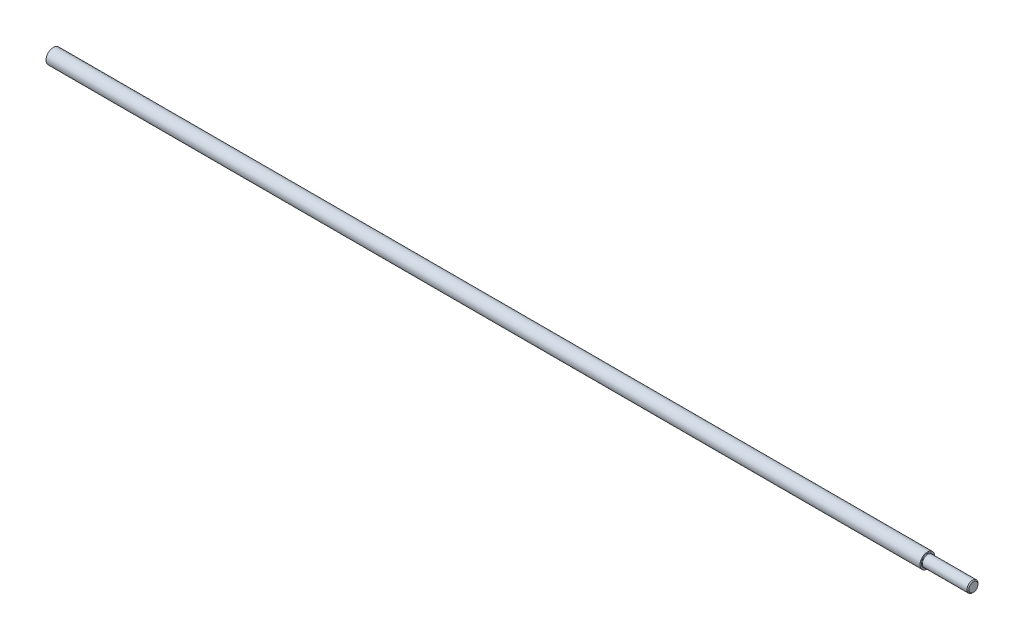
ISO-10303-21;
HEADER;
FILE_DESCRIPTION(('STEP AP214'),'2;1');
FILE_NAME('part.step','',(''),(''),'','','');
FILE_SCHEMA(('AUTOMOTIVE_DESIGN { 1 0 10303 214 1 1 1 1 }'));
ENDSEC;
DATA;
#1=APPLICATION_CONTEXT('core data for automotive mechanical design processes');
#2=APPLICATION_PROTOCOL_DEFINITION('international standard','automotive_design',2000,#1);
#3=PRODUCT_CONTEXT('',#1,'mechanical');
#4=PRODUCT('Part','Part','',(#3));
#5=PRODUCT_RELATED_PRODUCT_CATEGORY('part','',(#4));
#6=PRODUCT_DEFINITION_FORMATION('','',#4);
#7=PRODUCT_DEFINITION_CONTEXT('part definition',#1,'design');
#8=PRODUCT_DEFINITION('design','',#6,#7);
#9=PRODUCT_DEFINITION_SHAPE('','',#8);
#10=(LENGTH_UNIT() NAMED_UNIT(*) SI_UNIT(.MILLI.,.METRE.));
#11=(NAMED_UNIT(*) PLANE_ANGLE_UNIT() SI_UNIT($,.RADIAN.));
#12=(NAMED_UNIT(*) SI_UNIT($,.STERADIAN.) SOLID_ANGLE_UNIT());
#13=UNCERTAINTY_MEASURE_WITH_UNIT(LENGTH_MEASURE(1.E-05),#10,'distance_accuracy_value','');
#14=(GEOMETRIC_REPRESENTATION_CONTEXT(3) GLOBAL_UNCERTAINTY_ASSIGNED_CONTEXT((#13)) GLOBAL_UNIT_ASSIGNED_CONTEXT((#10,
#11,#12)) REPRESENTATION_CONTEXT('',''));
#15=CARTESIAN_POINT('',(0.,0.,0.));
#16=DIRECTION('',(0.,0.,1.));
#17=DIRECTION('',(1.,0.,0.));
#18=AXIS2_PLACEMENT_3D('',#15,#16,#17);
#19=CARTESIAN_POINT('',(0.,0.,0.));
#20=DIRECTION('',(1.,0.,0.));
#21=DIRECTION('',(0.,0.,-1.));
#22=AXIS2_PLACEMENT_3D('',#19,#20,#21);
#23=CYLINDRICAL_SURFACE('',#22,4.);
#24=CARTESIAN_POINT('',(0.,0.,0.));
#25=DIRECTION('',(1.,0.,0.));
#26=DIRECTION('',(0.,0.,-1.));
#27=AXIS2_PLACEMENT_3D('',#24,#25,#26);
#28=CIRCLE('',#27,4.);
#29=CARTESIAN_POINT('',(0.,0.,-4.));
#30=VERTEX_POINT('',#29);
#31=EDGE_CURVE('E56',#30,#30,#28,.T.);
#32=ORIENTED_EDGE('',*,*,#31,.T.);
#33=EDGE_LOOP('',(#32));
#34=FACE_BOUND('',#33,.T.);
#35=CARTESIAN_POINT('',(475.,0.,0.));
#36=DIRECTION('',(1.,0.,0.));
#37=DIRECTION('',(0.,0.,-1.));
#38=AXIS2_PLACEMENT_3D('',#35,#36,#37);
#39=CIRCLE('',#38,4.);
#40=CARTESIAN_POINT('',(475.,0.,-4.));
#41=VERTEX_POINT('',#40);
#42=EDGE_CURVE('E10',#41,#41,#39,.T.);
#43=ORIENTED_EDGE('',*,*,#42,.F.);
#44=EDGE_LOOP('',(#43));
#45=FACE_BOUND('',#44,.T.);
#46=ADVANCED_FACE('F34',(#34,#45),#23,.T.);
#47=CARTESIAN_POINT('',(474.999999999998,3.3,0.));
#48=DIRECTION('',(1.,0.,0.));
#49=DIRECTION('',(0.,0.,-1.));
#50=AXIS2_PLACEMENT_3D('',#47,#48,#49);
#51=PLANE('',#50);
#52=ORIENTED_EDGE('',*,*,#42,.T.);
#53=EDGE_LOOP('',(#52));
#54=FACE_BOUND('',#53,.T.);
#55=CARTESIAN_POINT('',(474.999999999996,0.,0.));
#56=DIRECTION('',(1.,0.,0.));
#57=DIRECTION('',(0.,0.,-1.));
#58=AXIS2_PLACEMENT_3D('',#55,#56,#57);
#59=CIRCLE('',#58,3.3);
#60=CARTESIAN_POINT('',(474.999999999996,0.,-3.3));
#61=VERTEX_POINT('',#60);
#62=EDGE_CURVE('E40',#61,#61,#59,.T.);
#63=ORIENTED_EDGE('',*,*,#62,.F.);
#64=EDGE_LOOP('',(#63));
#65=FACE_BOUND('',#64,.T.);
#66=ADVANCED_FACE('F73',(#54,#65),#51,.T.);
#67=CARTESIAN_POINT('',(475.299999999993,0.,0.));
#68=DIRECTION('',(1.,0.,0.));
#69=DIRECTION('',(0.,0.,-1.));
#70=AXIS2_PLACEMENT_3D('',#67,#68,#69);
#71=TOROIDAL_SURFACE('',#70,3.3,0.299999999996514);
#72=ORIENTED_EDGE('',*,*,#62,.T.);
#73=EDGE_LOOP('',(#72));
#74=FACE_BOUND('',#73,.T.);
#75=CARTESIAN_POINT('',(475.3,0.,0.));
#76=DIRECTION('',(1.,0.,0.));
#77=DIRECTION('',(0.,0.,-1.));
#78=AXIS2_PLACEMENT_3D('',#75,#76,#77);
#79=CIRCLE('',#78,3.);
#80=CARTESIAN_POINT('',(475.3,0.,-3.));
#81=VERTEX_POINT('',#80);
#82=EDGE_CURVE('E44',#81,#81,#79,.T.);
#83=ORIENTED_EDGE('',*,*,#82,.F.);
#84=EDGE_LOOP('',(#83));
#85=FACE_BOUND('',#84,.T.);
#86=ADVANCED_FACE('F77',(#74,#85),#71,.F.);
#87=CARTESIAN_POINT('',(0.,0.,0.));
#88=DIRECTION('',(1.,0.,0.));
#89=DIRECTION('',(0.,0.,-1.));
#90=AXIS2_PLACEMENT_3D('',#87,#88,#89);
#91=CYLINDRICAL_SURFACE('',#90,3.);
#92=ORIENTED_EDGE('',*,*,#82,.T.);
#93=EDGE_LOOP('',(#92));
#94=FACE_BOUND('',#93,.T.);
#95=CARTESIAN_POINT('',(499.5,0.,0.));
#96=DIRECTION('',(1.,0.,0.));
#97=DIRECTION('',(0.,0.,-1.));
#98=AXIS2_PLACEMENT_3D('',#95,#96,#97);
#99=CIRCLE('',#98,3.);
#100=CARTESIAN_POINT('',(499.5,0.,-3.));
#101=VERTEX_POINT('',#100);
#102=EDGE_CURVE('E48',#101,#101,#99,.T.);
#103=ORIENTED_EDGE('',*,*,#102,.F.);
#104=EDGE_LOOP('',(#103));
#105=FACE_BOUND('',#104,.T.);
#106=ADVANCED_FACE('F81',(#94,#105),#91,.T.);
#107=CARTESIAN_POINT('',(500.,0.,0.));
#108=DIRECTION('',(-1.,0.,0.));
#109=DIRECTION('',(0.,0.,1.));
#110=AXIS2_PLACEMENT_3D('',#107,#108,#109);
#111=CONICAL_SURFACE('',#110,2.5,0.785398163397448);
#112=ORIENTED_EDGE('',*,*,#102,.T.);
#113=EDGE_LOOP('',(#112));
#114=FACE_BOUND('',#113,.T.);
#115=CARTESIAN_POINT('',(500.,0.,0.));
#116=DIRECTION('',(1.,0.,0.));
#117=DIRECTION('',(0.,0.,-1.));
#118=AXIS2_PLACEMENT_3D('',#115,#116,#117);
#119=CIRCLE('',#118,2.5);
#120=CARTESIAN_POINT('',(500.,0.,-2.5));
#121=VERTEX_POINT('',#120);
#122=EDGE_CURVE('E53',#121,#121,#119,.T.);
#123=ORIENTED_EDGE('',*,*,#122,.F.);
#124=EDGE_LOOP('',(#123));
#125=FACE_BOUND('',#124,.T.);
#126=ADVANCED_FACE('F69',(#114,#125),#111,.T.);
#127=CARTESIAN_POINT('',(500.,0.,0.));
#128=DIRECTION('',(1.,0.,0.));
#129=DIRECTION('',(0.,0.,-1.));
#130=AXIS2_PLACEMENT_3D('',#127,#128,#129);
#131=PLANE('',#130);
#132=ORIENTED_EDGE('',*,*,#122,.T.);
#133=EDGE_LOOP('',(#132));
#134=FACE_BOUND('',#133,.T.);
#135=ADVANCED_FACE('F64',(#134),#131,.T.);
#136=CARTESIAN_POINT('',(0.,4.,0.));
#137=DIRECTION('',(-1.,0.,0.));
#138=DIRECTION('',(0.,0.,1.));
#139=AXIS2_PLACEMENT_3D('',#136,#137,#138);
#140=PLANE('',#139);
#141=ORIENTED_EDGE('',*,*,#31,.F.);
#142=EDGE_LOOP('',(#141));
#143=FACE_BOUND('',#142,.T.);
#144=ADVANCED_FACE('F62',(#143),#140,.T.);
#145=CLOSED_SHELL('',(#46,#66,#86,#106,#126,#135,#144));
#146=MANIFOLD_SOLID_BREP('B2',#145);
#147=ADVANCED_BREP_SHAPE_REPRESENTATION('',(#18,#146),#14);
#148=SHAPE_DEFINITION_REPRESENTATION(#9,#147);
ENDSEC;
END-ISO-10303-21;
